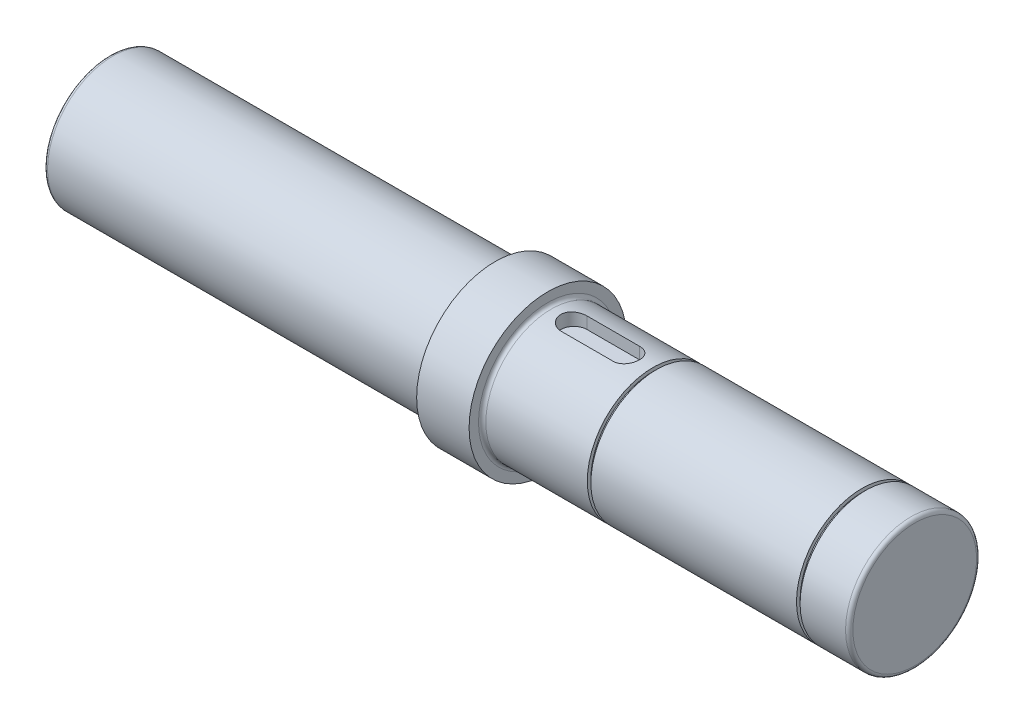
ISO-10303-21;
HEADER;
FILE_DESCRIPTION(('STEP AP214'),'2;1');
FILE_NAME('part.step','',(''),(''),'','','');
FILE_SCHEMA(('AUTOMOTIVE_DESIGN { 1 0 10303 214 1 1 1 1 }'));
ENDSEC;
DATA;
#1=APPLICATION_CONTEXT('core data for automotive mechanical design processes');
#2=APPLICATION_PROTOCOL_DEFINITION('international standard','automotive_design',2000,#1);
#3=PRODUCT_CONTEXT('',#1,'mechanical');
#4=PRODUCT('Part','Part','',(#3));
#5=PRODUCT_RELATED_PRODUCT_CATEGORY('part','',(#4));
#6=PRODUCT_DEFINITION_FORMATION('','',#4);
#7=PRODUCT_DEFINITION_CONTEXT('part definition',#1,'design');
#8=PRODUCT_DEFINITION('design','',#6,#7);
#9=PRODUCT_DEFINITION_SHAPE('','',#8);
#10=(LENGTH_UNIT() NAMED_UNIT(*) SI_UNIT(.MILLI.,.METRE.));
#11=(NAMED_UNIT(*) PLANE_ANGLE_UNIT() SI_UNIT($,.RADIAN.));
#12=(NAMED_UNIT(*) SI_UNIT($,.STERADIAN.) SOLID_ANGLE_UNIT());
#13=UNCERTAINTY_MEASURE_WITH_UNIT(LENGTH_MEASURE(1.E-05),#10,'distance_accuracy_value','');
#14=(GEOMETRIC_REPRESENTATION_CONTEXT(3) GLOBAL_UNCERTAINTY_ASSIGNED_CONTEXT((#13)) GLOBAL_UNIT_ASSIGNED_CONTEXT((#10,
#11,#12)) REPRESENTATION_CONTEXT('',''));
#15=CARTESIAN_POINT('',(0.,0.,0.));
#16=DIRECTION('',(0.,0.,1.));
#17=DIRECTION('',(1.,0.,0.));
#18=AXIS2_PLACEMENT_3D('',#15,#16,#17);
#19=CARTESIAN_POINT('',(0.,0.,0.));
#20=DIRECTION('',(-1.,0.,0.));
#21=DIRECTION('',(0.,0.,1.));
#22=AXIS2_PLACEMENT_3D('',#19,#20,#21);
#23=CYLINDRICAL_SURFACE('',#22,31.75);
#24=CARTESIAN_POINT('',(76.327,0.,0.));
#25=DIRECTION('',(-1.,0.,0.));
#26=DIRECTION('',(0.,0.,1.));
#27=AXIS2_PLACEMENT_3D('',#24,#25,#26);
#28=CIRCLE('',#27,31.75);
#29=CARTESIAN_POINT('',(76.327,0.,31.75));
#30=VERTEX_POINT('',#29);
#31=EDGE_CURVE('E101',#30,#30,#28,.T.);
#32=ORIENTED_EDGE('',*,*,#31,.T.);
#33=EDGE_LOOP('',(#32));
#34=FACE_BOUND('',#33,.T.);
#35=CARTESIAN_POINT('',(27.178,0.,0.));
#36=DIRECTION('',(-1.,0.,0.));
#37=DIRECTION('',(0.,0.,1.));
#38=AXIS2_PLACEMENT_3D('',#35,#36,#37);
#39=CIRCLE('',#38,31.75);
#40=CARTESIAN_POINT('',(27.178,0.,31.75));
#41=VERTEX_POINT('',#40);
#42=EDGE_CURVE('E197',#41,#41,#39,.T.);
#43=ORIENTED_EDGE('',*,*,#42,.F.);
#44=EDGE_LOOP('',(#43));
#45=FACE_BOUND('',#44,.T.);
#46=DIRECTION('',(-1.,0.,0.));
#47=VECTOR('',#46,1.);
#48=CARTESIAN_POINT('',(0.,31.1085197333464,6.35000000000001));
#49=LINE('',#48,#47);
#50=CARTESIAN_POINT('',(63.5,31.1085197333464,6.35));
#51=VERTEX_POINT('',#50);
#52=CARTESIAN_POINT('',(38.1,31.1085197333464,6.35));
#53=VERTEX_POINT('',#52);
#54=EDGE_CURVE('E62',#51,#53,#49,.T.);
#55=ORIENTED_EDGE('',*,*,#54,.T.);
#56=CARTESIAN_POINT('',(38.1,31.1085197333464,6.35));
#57=CARTESIAN_POINT('',(37.9233108351654,31.1085039048977,6.35002116870633));
#58=CARTESIAN_POINT('',(37.7466271481688,31.1100245268044,6.34262634497568));
#59=CARTESIAN_POINT('',(37.3945596487205,31.1160237603224,6.31315947098005));
#60=CARTESIAN_POINT('',(37.2191756781805,31.1205020060137,6.29108923636835));
#61=CARTESIAN_POINT('',(36.8712168207957,31.1322926618764,6.23247080872007));
#62=CARTESIAN_POINT('',(36.6986380696195,31.1396007541075,6.19594467145338));
#63=CARTESIAN_POINT('',(36.3572381754123,31.1568318420012,6.10870834329766));
#64=CARTESIAN_POINT('',(36.1884170477239,31.1667548483385,6.05799809450528));
#65=CARTESIAN_POINT('',(35.8557252699625,31.1889277561932,5.9427871683123));
#66=CARTESIAN_POINT('',(35.6918541559509,31.2011774388544,5.87828778789978));
#67=CARTESIAN_POINT('',(35.3701060160581,31.2276576717888,5.73595117685301));
#68=CARTESIAN_POINT('',(35.2122312346987,31.2418889546844,5.65810901075327));
#69=CARTESIAN_POINT('',(34.9036441102659,31.2719221019036,5.48969019735091));
#70=CARTESIAN_POINT('',(34.7529297440003,31.287723518634,5.39911717615937));
#71=CARTESIAN_POINT('',(34.4595578971861,31.3204654741843,5.20581898773431));
#72=CARTESIAN_POINT('',(34.3169034553038,31.3374064374204,5.10308928189229));
#73=CARTESIAN_POINT('',(34.0389617000876,31.3721657870236,4.88488113848266));
#74=CARTESIAN_POINT('',(33.9037854871061,31.3899923559764,4.76926246734966));
#75=CARTESIAN_POINT('',(33.64356928295,31.4258358202982,4.52706640642534));
#76=CARTESIAN_POINT('',(33.5185330670073,31.443852783757,4.40048497101893));
#77=CARTESIAN_POINT('',(33.2795240400947,31.4795651952709,4.13728229219212));
#78=CARTESIAN_POINT('',(33.1655489025911,31.4972607102985,4.00066317071855));
#79=CARTESIAN_POINT('',(32.9493767320231,31.5318494290015,3.71822762063949));
#80=CARTESIAN_POINT('',(32.8471840554499,31.5487423345683,3.57240782077796));
#81=CARTESIAN_POINT('',(32.6545430961016,31.5813855066594,3.27134555408801));
#82=CARTESIAN_POINT('',(32.5642000814885,31.5971250461394,3.11603453473924));
#83=CARTESIAN_POINT('',(32.396906241239,31.6268635269183,2.79812380902994));
#84=CARTESIAN_POINT('',(32.3199604381656,31.6408618148695,2.63552139776));
#85=CARTESIAN_POINT('',(32.1801224672853,31.6667053478679,2.30431058211544));
#86=CARTESIAN_POINT('',(32.1172233211822,31.6785516614553,2.13570520846399));
#87=CARTESIAN_POINT('',(32.0059026664174,31.699763919737,1.79355860197955));
#88=CARTESIAN_POINT('',(31.9574863984016,31.7091289664424,1.62001560727813));
#89=CARTESIAN_POINT('',(31.876099930763,31.7249958152219,1.271665337988));
#90=CARTESIAN_POINT('',(31.8429321188382,31.7315341792257,1.09690588587055));
#91=CARTESIAN_POINT('',(31.7913652175721,31.7417427444523,0.745135527954367));
#92=CARTESIAN_POINT('',(31.7729662367973,31.7454129245909,0.568124605614686));
#93=CARTESIAN_POINT('',(31.7510881876713,31.7497805646417,0.213158804110465));
#94=CARTESIAN_POINT('',(31.7476080858247,31.7504782304726,0.0352039911884503));
#95=CARTESIAN_POINT('',(31.7555935614074,31.7488815175662,-0.320355861532066));
#96=CARTESIAN_POINT('',(31.767059035046,31.7465871596071,-0.497960903751));
#97=CARTESIAN_POINT('',(31.8045715380183,31.7391255185198,-0.848995672171194));
#98=CARTESIAN_POINT('',(31.8304081642491,31.7339996971821,-1.02244881452811));
#99=CARTESIAN_POINT('',(31.8963081823647,31.7210458476606,-1.36652479398735));
#100=CARTESIAN_POINT('',(31.9363713334678,31.7132178652105,-1.53714767894016));
#101=CARTESIAN_POINT('',(32.0304249188964,31.6950723967427,-1.87441004012347));
#102=CARTESIAN_POINT('',(32.0844181319873,31.6847544140469,-2.04104871432941));
#103=CARTESIAN_POINT('',(32.2059001366246,31.6619149454476,-2.36910786568285));
#104=CARTESIAN_POINT('',(32.2733842512283,31.6493942233562,-2.53053012875757));
#105=CARTESIAN_POINT('',(32.4218601783,31.6223957034097,-2.84818724824965));
#106=CARTESIAN_POINT('',(32.502939035027,31.6079054159621,-3.00438035215416));
#107=CARTESIAN_POINT('',(32.6776712522136,31.5774326747622,-3.30933886567148));
#108=CARTESIAN_POINT('',(32.7713202179686,31.561450743104,-3.45810684639707));
#109=CARTESIAN_POINT('',(32.970603500097,31.5284165857884,-3.74735222897073));
#110=CARTESIAN_POINT('',(33.0762428402126,31.5113639128573,-3.88782611799903));
#111=CARTESIAN_POINT('',(33.298716928451,31.4766620567231,-4.15944574616747));
#112=CARTESIAN_POINT('',(33.4155477604606,31.4590130835657,-4.2905947204857));
#113=CARTESIAN_POINT('',(33.6618218514731,31.4232767982799,-4.54499379526856));
#114=CARTESIAN_POINT('',(33.7914517850338,31.4051872576023,-4.6680629439482));
#115=CARTESIAN_POINT('',(34.0606029663649,31.3693950976011,-4.90282051214633));
#116=CARTESIAN_POINT('',(34.2001206430503,31.3516923415769,-5.01451300532672));
#117=CARTESIAN_POINT('',(34.488239139017,31.3171574864215,-5.22586107228326));
#118=CARTESIAN_POINT('',(34.6368458747266,31.3003259678598,-5.32550867723439));
#119=CARTESIAN_POINT('',(34.9419884353452,31.2680353267224,-5.5119340520932));
#120=CARTESIAN_POINT('',(35.098521209755,31.252575682364,-5.59871672358086));
#121=CARTESIAN_POINT('',(35.4189874205828,31.223425373653,-5.75906880614595));
#122=CARTESIAN_POINT('',(35.5829423302281,31.2097403519898,-5.83259634629917));
#123=CARTESIAN_POINT('',(35.9165786830982,31.1846063686895,-5.96551779545906));
#124=CARTESIAN_POINT('',(36.0862578593376,31.1731565337636,-6.02491722631501));
#125=CARTESIAN_POINT('',(36.4300011137611,31.1528408342497,-6.12909659949344));
#126=CARTESIAN_POINT('',(36.6040604163827,31.1439722775706,-6.1738917789216));
#127=CARTESIAN_POINT('',(36.9553966617676,31.1290753988845,-6.24856905180784));
#128=CARTESIAN_POINT('',(37.1326720326826,31.1230457262539,-6.27845823732312));
#129=CARTESIAN_POINT('',(37.4418341863337,31.1152061209695,-6.31717753778337));
#130=CARTESIAN_POINT('',(37.573278000551,31.1127009336914,-6.32949166864359));
#131=CARTESIAN_POINT('',(37.8364771978161,31.1093569479481,-6.34589839064755));
#132=CARTESIAN_POINT('',(37.9682316881389,31.1085153607586,-6.35000474077799));
#133=CARTESIAN_POINT('',(38.1,31.1085197333464,-6.35));
#134=B_SPLINE_CURVE_WITH_KNOTS('',3,(#56,#57,#58,#59,#60,#61,#62,#63,#64,#65,#66,#67,#68,#69,
#70,#71,#72,#73,#74,#75,#76,#77,#78,#79,#80,#81,#82,#83,#84,#85,#86,#87,#88,#89,#90,#91,#92,#93,
#94,#95,#96,#97,#98,#99,#100,#101,#102,#103,#104,#105,#106,#107,#108,#109,#110,#111,#112,#113,
#114,#115,#116,#117,#118,#119,#120,#121,#122,#123,#124,#125,#126,#127,#128,#129,#130,#131,#132,
#133),.UNSPECIFIED.,.F.,.F.,(4,2,2,2,2,2,2,2,2,2,2,2,2,2,2,2,2,2,2,2,2,2,2,2,2,2,2,2,2,2,2,2,2,
2,2,2,2,2,4),(0.,0.529898040772802,1.05973053434175,1.58875774510194,2.11778711552501,
2.64676674799753,3.17594247273483,3.70496777739679,4.23419121660084,4.76987063032171,
5.30574857636785,5.84151356303558,6.37747601445001,6.91791683404275,7.45855982859046,
7.9989336344186,8.53950273925023,9.07285386554479,9.6062089124942,10.1395270110335,
10.6728414059212,11.1985457780125,11.7242412530668,12.2500416749135,12.775660130621,
13.3047823855987,13.8337201307617,14.362880314746,14.8918560073651,15.4301968495918,
15.9683442443244,16.5068457476941,17.0451415500575,17.5851090378882,18.1248651360272,
18.6640562728021,19.2029906248677,19.5988660670097,19.9940773310255),.UNSPECIFIED.);
#135=CARTESIAN_POINT('',(38.1,31.1085197333464,-6.35));
#136=VERTEX_POINT('',#135);
#137=EDGE_CURVE('E11',#53,#136,#134,.T.);
#138=ORIENTED_EDGE('',*,*,#137,.T.);
#139=DIRECTION('',(-1.,0.,0.));
#140=VECTOR('',#139,1.);
#141=CARTESIAN_POINT('',(0.,31.1085197333464,-6.34999999999999));
#142=LINE('',#141,#140);
#143=CARTESIAN_POINT('',(63.5,31.1085197333464,-6.34999999999999));
#144=VERTEX_POINT('',#143);
#145=EDGE_CURVE('E201',#144,#136,#142,.T.);
#146=ORIENTED_EDGE('',*,*,#145,.F.);
#147=CARTESIAN_POINT('',(63.5,31.1085197333464,-6.35));
#148=CARTESIAN_POINT('',(63.6766891648346,31.1085039048977,-6.35002116870633));
#149=CARTESIAN_POINT('',(63.8533728518311,31.1100245268044,-6.34262634497569));
#150=CARTESIAN_POINT('',(64.2054403512795,31.1160237603224,-6.31315947098006));
#151=CARTESIAN_POINT('',(64.3808243218194,31.1205020060137,-6.29108923636836));
#152=CARTESIAN_POINT('',(64.7287831792042,31.1322926618764,-6.23247080872008));
#153=CARTESIAN_POINT('',(64.9013619303804,31.1396007541075,-6.19594467145338));
#154=CARTESIAN_POINT('',(65.2427618245877,31.1568318420012,-6.10870834329767));
#155=CARTESIAN_POINT('',(65.4115829522761,31.1667548483385,-6.05799809450529));
#156=CARTESIAN_POINT('',(65.7442747300375,31.1889277561932,-5.94278716831231));
#157=CARTESIAN_POINT('',(65.9081458440491,31.2011774388544,-5.87828778789979));
#158=CARTESIAN_POINT('',(66.2298939839419,31.2276576717888,-5.73595117685302));
#159=CARTESIAN_POINT('',(66.3877687653012,31.2418889546844,-5.65810901075328));
#160=CARTESIAN_POINT('',(66.6963558897341,31.2719221019036,-5.48969019735092));
#161=CARTESIAN_POINT('',(66.8470702559996,31.287723518634,-5.39911717615938));
#162=CARTESIAN_POINT('',(67.1404421028139,31.3204654741843,-5.20581898773432));
#163=CARTESIAN_POINT('',(67.2830965446962,31.3374064374204,-5.1030892818923));
#164=CARTESIAN_POINT('',(67.5610382999123,31.3721657870236,-4.88488113848267));
#165=CARTESIAN_POINT('',(67.6962145128939,31.3899923559764,-4.76926246734967));
#166=CARTESIAN_POINT('',(67.9564307170499,31.4258358202982,-4.52706640642534));
#167=CARTESIAN_POINT('',(68.0814669329927,31.443852783757,-4.40048497101893));
#168=CARTESIAN_POINT('',(68.3204759599053,31.4795651952708,-4.13728229219212));
#169=CARTESIAN_POINT('',(68.4344510974089,31.4972607102985,-4.00066317071856));
#170=CARTESIAN_POINT('',(68.6506232679768,31.5318494290015,-3.7182276206395));
#171=CARTESIAN_POINT('',(68.7528159445501,31.5487423345683,-3.57240782077797));
#172=CARTESIAN_POINT('',(68.9454569038983,31.5813855066594,-3.27134555408803));
#173=CARTESIAN_POINT('',(69.0357999185114,31.5971250461394,-3.11603453473926));
#174=CARTESIAN_POINT('',(69.2030937587609,31.6268635269183,-2.79812380902996));
#175=CARTESIAN_POINT('',(69.2800395618344,31.6408618148695,-2.63552139776002));
#176=CARTESIAN_POINT('',(69.4198775327146,31.6667053478679,-2.30431058211546));
#177=CARTESIAN_POINT('',(69.4827766788177,31.6785516614553,-2.13570520846401));
#178=CARTESIAN_POINT('',(69.5940973335826,31.699763919737,-1.79355860197957));
#179=CARTESIAN_POINT('',(69.6425136015984,31.7091289664424,-1.62001560727815));
#180=CARTESIAN_POINT('',(69.723900069237,31.7249958152219,-1.27166533798801));
#181=CARTESIAN_POINT('',(69.7570678811618,31.7315341792257,-1.09690588587056));
#182=CARTESIAN_POINT('',(69.8086347824278,31.7417427444523,-0.745135527954382));
#183=CARTESIAN_POINT('',(69.8270337632026,31.7454129245909,-0.568124605614701));
#184=CARTESIAN_POINT('',(69.8489118123287,31.7497805646417,-0.213158804110481));
#185=CARTESIAN_POINT('',(69.8523919141753,31.7504782304726,-0.0352039911884656));
#186=CARTESIAN_POINT('',(69.8444064385925,31.7488815175662,0.320355861532051));
#187=CARTESIAN_POINT('',(69.832940964954,31.7465871596071,0.497960903750986));
#188=CARTESIAN_POINT('',(69.7954284619817,31.7391255185198,0.848995672171182));
#189=CARTESIAN_POINT('',(69.7695918357508,31.7339996971821,1.0224488145281));
#190=CARTESIAN_POINT('',(69.7036918176353,31.7210458476606,1.36652479398733));
#191=CARTESIAN_POINT('',(69.6636286665322,31.7132178652105,1.53714767894015));
#192=CARTESIAN_POINT('',(69.5695750811035,31.6950723967427,1.87441004012346));
#193=CARTESIAN_POINT('',(69.5155818680127,31.6847544140469,2.04104871432941));
#194=CARTESIAN_POINT('',(69.3940998633754,31.6619149454476,2.36910786568284));
#195=CARTESIAN_POINT('',(69.3266157487717,31.6493942233562,2.53053012875756));
#196=CARTESIAN_POINT('',(69.1781398216999,31.6223957034097,2.84818724824964));
#197=CARTESIAN_POINT('',(69.097060964973,31.6079054159621,3.00438035215415));
#198=CARTESIAN_POINT('',(68.9223287477864,31.5774326747622,3.30933886567147));
#199=CARTESIAN_POINT('',(68.8286797820313,31.561450743104,3.45810684639706));
#200=CARTESIAN_POINT('',(68.629396499903,31.5284165857884,3.74735222897071));
#201=CARTESIAN_POINT('',(68.5237571597874,31.5113639128573,3.88782611799901));
#202=CARTESIAN_POINT('',(68.301283071549,31.4766620567231,4.15944574616745));
#203=CARTESIAN_POINT('',(68.1844522395394,31.4590130835657,4.29059472048568));
#204=CARTESIAN_POINT('',(67.9381781485269,31.4232767982799,4.54499379526855));
#205=CARTESIAN_POINT('',(67.8085482149662,31.4051872576023,4.66806294394819));
#206=CARTESIAN_POINT('',(67.539397033635,31.3693950976011,4.90282051214631));
#207=CARTESIAN_POINT('',(67.3998793569497,31.3516923415769,5.0145130053267));
#208=CARTESIAN_POINT('',(67.111760860983,31.3171574864215,5.22586107228324));
#209=CARTESIAN_POINT('',(66.9631541252734,31.3003259678598,5.32550867723437));
#210=CARTESIAN_POINT('',(66.6580115646548,31.2680353267224,5.51193405209319));
#211=CARTESIAN_POINT('',(66.501478790245,31.252575682364,5.59871672358085));
#212=CARTESIAN_POINT('',(66.1810125794172,31.223425373653,5.75906880614594));
#213=CARTESIAN_POINT('',(66.0170576697719,31.2097403519898,5.83259634629916));
#214=CARTESIAN_POINT('',(65.6834213169018,31.1846063686895,5.96551779545906));
#215=CARTESIAN_POINT('',(65.5137421406623,31.1731565337636,6.024917226315));
#216=CARTESIAN_POINT('',(65.1699988862389,31.1528408342497,6.12909659949343));
#217=CARTESIAN_POINT('',(64.9959395836173,31.1439722775706,6.1738917789216));
#218=CARTESIAN_POINT('',(64.6446033382323,31.1290753988845,6.24856905180784));
#219=CARTESIAN_POINT('',(64.4673279673174,31.1230457262539,6.27845823732312));
#220=CARTESIAN_POINT('',(64.1581658136663,31.1152061209695,6.31717753778337));
#221=CARTESIAN_POINT('',(64.0267219994489,31.1127009336914,6.32949166864359));
#222=CARTESIAN_POINT('',(63.7635228021838,31.1093569479481,6.34589839064755));
#223=CARTESIAN_POINT('',(63.6317683118611,31.1085153607586,6.35000474077798));
#224=CARTESIAN_POINT('',(63.5,31.1085197333464,6.35));
#225=B_SPLINE_CURVE_WITH_KNOTS('',3,(#147,#148,#149,#150,#151,#152,#153,#154,#155,#156,#157,
#158,#159,#160,#161,#162,#163,#164,#165,#166,#167,#168,#169,#170,#171,#172,#173,#174,#175,#176,
#177,#178,#179,#180,#181,#182,#183,#184,#185,#186,#187,#188,#189,#190,#191,#192,#193,#194,#195,
#196,#197,#198,#199,#200,#201,#202,#203,#204,#205,#206,#207,#208,#209,#210,#211,#212,#213,#214,
#215,#216,#217,#218,#219,#220,#221,#222,#223,#224),.UNSPECIFIED.,.F.,.F.,(4,2,2,2,2,2,2,2,2,2,2,
2,2,2,2,2,2,2,2,2,2,2,2,2,2,2,2,2,2,2,2,2,2,2,2,2,2,2,4),(0.,0.529898040772788,1.05973053434174,
1.58875774510192,2.117787115525,2.64676674799751,3.17594247273482,3.70496777739679,
4.23419121660083,4.7698706303217,5.30574857636785,5.84151356303558,6.37747601445,
6.91791683404273,7.45855982859044,7.99893363441858,8.53950273925021,9.07285386554477,
9.60620891249419,10.1395270110335,10.6728414059212,11.1985457780125,11.7242412530668,
12.2500416749135,12.775660130621,13.3047823855987,13.8337201307617,14.362880314746,
14.8918560073651,15.4301968495918,15.9683442443244,16.5068457476941,17.0451415500575,
17.5851090378882,18.1248651360272,18.6640562728021,19.2029906248677,19.5988660670097,
19.9940773310255),.UNSPECIFIED.);
#226=EDGE_CURVE('E204',#144,#51,#225,.T.);
#227=ORIENTED_EDGE('',*,*,#226,.T.);
#228=EDGE_LOOP('',(#55,#138,#146,#227));
#229=FACE_BOUND('',#228,.T.);
#230=ADVANCED_FACE('F47',(#34,#45,#229),#23,.T.);
#231=CARTESIAN_POINT('',(27.178,0.,0.));
#232=DIRECTION('',(-1.,0.,0.));
#233=DIRECTION('',(0.,0.,1.));
#234=AXIS2_PLACEMENT_3D('',#231,#232,#233);
#235=TOROIDAL_SURFACE('',#234,33.528,1.778);
#236=CARTESIAN_POINT('',(25.4,0.,0.));
#237=DIRECTION('',(-1.,0.,0.));
#238=DIRECTION('',(0.,0.,1.));
#239=AXIS2_PLACEMENT_3D('',#236,#237,#238);
#240=CIRCLE('',#239,33.528);
#241=CARTESIAN_POINT('',(25.4,0.,33.528));
#242=VERTEX_POINT('',#241);
#243=EDGE_CURVE('E193',#242,#242,#240,.T.);
#244=ORIENTED_EDGE('',*,*,#243,.F.);
#245=EDGE_LOOP('',(#244));
#246=FACE_BOUND('',#245,.T.);
#247=ORIENTED_EDGE('',*,*,#42,.T.);
#248=EDGE_LOOP('',(#247));
#249=FACE_BOUND('',#248,.T.);
#250=ADVANCED_FACE('F49',(#246,#249),#235,.F.);
#251=CARTESIAN_POINT('',(25.4,0.,0.));
#252=DIRECTION('',(-1.,0.,0.));
#253=DIRECTION('',(0.,0.,1.));
#254=AXIS2_PLACEMENT_3D('',#251,#252,#253);
#255=PLANE('',#254);
#256=CARTESIAN_POINT('',(25.4,0.,0.));
#257=DIRECTION('',(-1.,0.,0.));
#258=DIRECTION('',(0.,0.,1.));
#259=AXIS2_PLACEMENT_3D('',#256,#257,#258);
#260=CIRCLE('',#259,38.1);
#261=CARTESIAN_POINT('',(25.4,0.,38.1));
#262=VERTEX_POINT('',#261);
#263=EDGE_CURVE('E189',#262,#262,#260,.T.);
#264=ORIENTED_EDGE('',*,*,#263,.F.);
#265=EDGE_LOOP('',(#264));
#266=FACE_BOUND('',#265,.T.);
#267=ORIENTED_EDGE('',*,*,#243,.T.);
#268=EDGE_LOOP('',(#267));
#269=FACE_BOUND('',#268,.T.);
#270=ADVANCED_FACE('F251',(#266,#269),#255,.F.);
#271=CARTESIAN_POINT('',(0.,0.,0.));
#272=DIRECTION('',(-1.,0.,0.));
#273=DIRECTION('',(0.,0.,1.));
#274=AXIS2_PLACEMENT_3D('',#271,#272,#273);
#275=CYLINDRICAL_SURFACE('',#274,38.1);
#276=CARTESIAN_POINT('',(0.,0.,0.));
#277=DIRECTION('',(-1.,0.,0.));
#278=DIRECTION('',(0.,0.,1.));
#279=AXIS2_PLACEMENT_3D('',#276,#277,#278);
#280=CIRCLE('',#279,38.1);
#281=CARTESIAN_POINT('',(0.,0.,38.1));
#282=VERTEX_POINT('',#281);
#283=EDGE_CURVE('E185',#282,#282,#280,.T.);
#284=ORIENTED_EDGE('',*,*,#283,.F.);
#285=EDGE_LOOP('',(#284));
#286=FACE_BOUND('',#285,.T.);
#287=ORIENTED_EDGE('',*,*,#263,.T.);
#288=EDGE_LOOP('',(#287));
#289=FACE_BOUND('',#288,.T.);
#290=ADVANCED_FACE('F299',(#286,#289),#275,.T.);
#291=CARTESIAN_POINT('',(0.,0.,0.));
#292=DIRECTION('',(-1.,0.,0.));
#293=DIRECTION('',(0.,0.,1.));
#294=AXIS2_PLACEMENT_3D('',#291,#292,#293);
#295=PLANE('',#294);
#296=ORIENTED_EDGE('',*,*,#283,.T.);
#297=EDGE_LOOP('',(#296));
#298=FACE_BOUND('',#297,.T.);
#299=CARTESIAN_POINT('',(0.,0.,0.));
#300=DIRECTION('',(-1.,0.,0.));
#301=DIRECTION('',(0.,0.,1.));
#302=AXIS2_PLACEMENT_3D('',#299,#300,#301);
#303=CIRCLE('',#302,33.528);
#304=CARTESIAN_POINT('',(0.,0.,33.528));
#305=VERTEX_POINT('',#304);
#306=EDGE_CURVE('E181',#305,#305,#303,.T.);
#307=ORIENTED_EDGE('',*,*,#306,.F.);
#308=EDGE_LOOP('',(#307));
#309=FACE_BOUND('',#308,.T.);
#310=ADVANCED_FACE('F295',(#298,#309),#295,.T.);
#311=CARTESIAN_POINT('',(-1.778,0.,0.));
#312=DIRECTION('',(-1.,0.,0.));
#313=DIRECTION('',(0.,0.,1.));
#314=AXIS2_PLACEMENT_3D('',#311,#312,#313);
#315=TOROIDAL_SURFACE('',#314,33.528,1.778);
#316=ORIENTED_EDGE('',*,*,#306,.T.);
#317=EDGE_LOOP('',(#316));
#318=FACE_BOUND('',#317,.T.);
#319=CARTESIAN_POINT('',(-1.77800000000001,0.,0.));
#320=DIRECTION('',(-1.,0.,0.));
#321=DIRECTION('',(0.,0.,1.));
#322=AXIS2_PLACEMENT_3D('',#319,#320,#321);
#323=CIRCLE('',#322,31.75);
#324=CARTESIAN_POINT('',(-1.77800000000001,0.,31.75));
#325=VERTEX_POINT('',#324);
#326=EDGE_CURVE('E177',#325,#325,#323,.T.);
#327=ORIENTED_EDGE('',*,*,#326,.F.);
#328=EDGE_LOOP('',(#327));
#329=FACE_BOUND('',#328,.T.);
#330=ADVANCED_FACE('F291',(#318,#329),#315,.F.);
#331=CARTESIAN_POINT('',(0.,0.,0.));
#332=DIRECTION('',(-1.,0.,0.));
#333=DIRECTION('',(0.,0.,1.));
#334=AXIS2_PLACEMENT_3D('',#331,#332,#333);
#335=CYLINDRICAL_SURFACE('',#334,31.75);
#336=CARTESIAN_POINT('',(-185.166,0.,0.));
#337=DIRECTION('',(-1.,0.,0.));
#338=DIRECTION('',(0.,0.,1.));
#339=AXIS2_PLACEMENT_3D('',#336,#337,#338);
#340=CIRCLE('',#339,31.75);
#341=CARTESIAN_POINT('',(-185.166,0.,31.75));
#342=VERTEX_POINT('',#341);
#343=EDGE_CURVE('E173',#342,#342,#340,.T.);
#344=ORIENTED_EDGE('',*,*,#343,.F.);
#345=EDGE_LOOP('',(#344));
#346=FACE_BOUND('',#345,.T.);
#347=ORIENTED_EDGE('',*,*,#326,.T.);
#348=EDGE_LOOP('',(#347));
#349=FACE_BOUND('',#348,.T.);
#350=ADVANCED_FACE('F287',(#346,#349),#335,.T.);
#351=CARTESIAN_POINT('',(-185.166,0.,0.));
#352=DIRECTION('',(-1.,0.,0.));
#353=DIRECTION('',(0.,0.,1.));
#354=AXIS2_PLACEMENT_3D('',#351,#352,#353);
#355=TOROIDAL_SURFACE('',#354,29.972,1.778);
#356=ORIENTED_EDGE('',*,*,#343,.T.);
#357=EDGE_LOOP('',(#356));
#358=FACE_BOUND('',#357,.T.);
#359=CARTESIAN_POINT('',(-186.944,0.,0.));
#360=DIRECTION('',(-1.,0.,0.));
#361=DIRECTION('',(0.,0.,1.));
#362=AXIS2_PLACEMENT_3D('',#359,#360,#361);
#363=CIRCLE('',#362,29.972);
#364=CARTESIAN_POINT('',(-186.944,0.,29.972));
#365=VERTEX_POINT('',#364);
#366=EDGE_CURVE('E169',#365,#365,#363,.T.);
#367=ORIENTED_EDGE('',*,*,#366,.F.);
#368=EDGE_LOOP('',(#367));
#369=FACE_BOUND('',#368,.T.);
#370=ADVANCED_FACE('F281',(#358,#369),#355,.T.);
#371=CARTESIAN_POINT('',(-186.944,0.,0.));
#372=DIRECTION('',(-1.,0.,0.));
#373=DIRECTION('',(0.,0.,1.));
#374=AXIS2_PLACEMENT_3D('',#371,#372,#373);
#375=PLANE('',#374);
#376=ORIENTED_EDGE('',*,*,#366,.T.);
#377=EDGE_LOOP('',(#376));
#378=FACE_BOUND('',#377,.T.);
#379=ADVANCED_FACE('F276',(#378),#375,.T.);
#380=CARTESIAN_POINT('',(203.2,0.,1.88173394004264E-13));
#381=DIRECTION('',(-1.,0.,0.));
#382=DIRECTION('',(0.,0.,1.));
#383=AXIS2_PLACEMENT_3D('',#380,#381,#382);
#384=PLANE('',#383);
#385=CARTESIAN_POINT('',(203.2,0.,0.));
#386=DIRECTION('',(-1.,0.,0.));
#387=DIRECTION('',(0.,0.,1.));
#388=AXIS2_PLACEMENT_3D('',#385,#386,#387);
#389=CIRCLE('',#388,29.972);
#390=CARTESIAN_POINT('',(203.2,0.,29.972));
#391=VERTEX_POINT('',#390);
#392=EDGE_CURVE('E165',#391,#391,#389,.T.);
#393=ORIENTED_EDGE('',*,*,#392,.F.);
#394=EDGE_LOOP('',(#393));
#395=FACE_BOUND('',#394,.T.);
#396=ADVANCED_FACE('F265',(#395),#384,.F.);
#397=CARTESIAN_POINT('',(201.422,0.,0.));
#398=DIRECTION('',(-1.,0.,0.));
#399=DIRECTION('',(0.,0.,1.));
#400=AXIS2_PLACEMENT_3D('',#397,#398,#399);
#401=TOROIDAL_SURFACE('',#400,29.972,1.77800000000001);
#402=CARTESIAN_POINT('',(201.422,0.,0.));
#403=DIRECTION('',(-1.,0.,0.));
#404=DIRECTION('',(0.,0.,1.));
#405=AXIS2_PLACEMENT_3D('',#402,#403,#404);
#406=CIRCLE('',#405,31.75);
#407=CARTESIAN_POINT('',(201.422,0.,31.75));
#408=VERTEX_POINT('',#407);
#409=EDGE_CURVE('E161',#408,#408,#406,.T.);
#410=ORIENTED_EDGE('',*,*,#409,.F.);
#411=EDGE_LOOP('',(#410));
#412=FACE_BOUND('',#411,.T.);
#413=ORIENTED_EDGE('',*,*,#392,.T.);
#414=EDGE_LOOP('',(#413));
#415=FACE_BOUND('',#414,.T.);
#416=ADVANCED_FACE('F256',(#412,#415),#401,.T.);
#417=ORIENTED_EDGE('',*,*,#409,.T.);
#418=EDGE_LOOP('',(#417));
#419=FACE_BOUND('',#418,.T.);
#420=CARTESIAN_POINT('',(179.4002,0.,0.));
#421=DIRECTION('',(-1.,0.,0.));
#422=DIRECTION('',(0.,0.,1.));
#423=AXIS2_PLACEMENT_3D('',#420,#421,#422);
#424=CIRCLE('',#423,31.75);
#425=CARTESIAN_POINT('',(179.4002,0.,31.75));
#426=VERTEX_POINT('',#425);
#427=EDGE_CURVE('E157',#426,#426,#424,.T.);
#428=ORIENTED_EDGE('',*,*,#427,.F.);
#429=EDGE_LOOP('',(#428));
#430=FACE_BOUND('',#429,.T.);
#431=ADVANCED_FACE('F243',(#419,#430),#23,.T.);
#432=CARTESIAN_POINT('',(179.4002,0.,0.));
#433=DIRECTION('',(1.,0.,0.));
#434=DIRECTION('',(0.,0.,-1.));
#435=AXIS2_PLACEMENT_3D('',#432,#433,#434);
#436=PLANE('',#435);
#437=CARTESIAN_POINT('',(179.4002,0.,0.));
#438=DIRECTION('',(-1.,0.,0.));
#439=DIRECTION('',(0.,0.,1.));
#440=AXIS2_PLACEMENT_3D('',#437,#438,#439);
#441=CIRCLE('',#440,30.0228);
#442=CARTESIAN_POINT('',(179.4002,0.,30.0228));
#443=VERTEX_POINT('',#442);
#444=EDGE_CURVE('E153',#443,#443,#441,.T.);
#445=ORIENTED_EDGE('',*,*,#444,.F.);
#446=EDGE_LOOP('',(#445));
#447=FACE_BOUND('',#446,.T.);
#448=ORIENTED_EDGE('',*,*,#427,.T.);
#449=EDGE_LOOP('',(#448));
#450=FACE_BOUND('',#449,.T.);
#451=ADVANCED_FACE('F255',(#447,#450),#436,.F.);
#452=CARTESIAN_POINT('',(0.,0.,0.));
#453=DIRECTION('',(-1.,0.,0.));
#454=DIRECTION('',(0.,0.,1.));
#455=AXIS2_PLACEMENT_3D('',#452,#453,#454);
#456=CYLINDRICAL_SURFACE('',#455,30.0228);
#457=ORIENTED_EDGE('',*,*,#444,.T.);
#458=EDGE_LOOP('',(#457));
#459=FACE_BOUND('',#458,.T.);
#460=CARTESIAN_POINT('',(177.673,0.,0.));
#461=DIRECTION('',(-1.,0.,0.));
#462=DIRECTION('',(0.,0.,1.));
#463=AXIS2_PLACEMENT_3D('',#460,#461,#462);
#464=CIRCLE('',#463,30.0228);
#465=CARTESIAN_POINT('',(177.673,0.,30.0228));
#466=VERTEX_POINT('',#465);
#467=EDGE_CURVE('E149',#466,#466,#464,.T.);
#468=ORIENTED_EDGE('',*,*,#467,.F.);
#469=EDGE_LOOP('',(#468));
#470=FACE_BOUND('',#469,.T.);
#471=ADVANCED_FACE('F262',(#459,#470),#456,.T.);
#472=CARTESIAN_POINT('',(177.673,0.,0.));
#473=DIRECTION('',(1.,0.,0.));
#474=DIRECTION('',(0.,0.,-1.));
#475=AXIS2_PLACEMENT_3D('',#472,#473,#474);
#476=PLANE('',#475);
#477=ORIENTED_EDGE('',*,*,#467,.T.);
#478=EDGE_LOOP('',(#477));
#479=FACE_BOUND('',#478,.T.);
#480=CARTESIAN_POINT('',(177.673,0.,0.));
#481=DIRECTION('',(-1.,0.,0.));
#482=DIRECTION('',(0.,0.,1.));
#483=AXIS2_PLACEMENT_3D('',#480,#481,#482);
#484=CIRCLE('',#483,31.75);
#485=CARTESIAN_POINT('',(177.673,0.,31.75));
#486=VERTEX_POINT('',#485);
#487=EDGE_CURVE('E145',#486,#486,#484,.T.);
#488=ORIENTED_EDGE('',*,*,#487,.F.);
#489=EDGE_LOOP('',(#488));
#490=FACE_BOUND('',#489,.T.);
#491=ADVANCED_FACE('F241',(#479,#490),#476,.T.);
#492=ORIENTED_EDGE('',*,*,#487,.T.);
#493=EDGE_LOOP('',(#492));
#494=FACE_BOUND('',#493,.T.);
#495=CARTESIAN_POINT('',(78.0542,0.,0.));
#496=DIRECTION('',(-1.,0.,0.));
#497=DIRECTION('',(0.,0.,1.));
#498=AXIS2_PLACEMENT_3D('',#495,#496,#497);
#499=CIRCLE('',#498,31.75);
#500=CARTESIAN_POINT('',(78.0542,0.,31.75));
#501=VERTEX_POINT('',#500);
#502=EDGE_CURVE('E141',#501,#501,#499,.T.);
#503=ORIENTED_EDGE('',*,*,#502,.F.);
#504=EDGE_LOOP('',(#503));
#505=FACE_BOUND('',#504,.T.);
#506=ADVANCED_FACE('F212',(#494,#505),#23,.T.);
#507=CARTESIAN_POINT('',(78.0542,0.,0.));
#508=DIRECTION('',(1.,0.,0.));
#509=DIRECTION('',(0.,0.,-1.));
#510=AXIS2_PLACEMENT_3D('',#507,#508,#509);
#511=PLANE('',#510);
#512=CARTESIAN_POINT('',(78.0542,0.,0.));
#513=DIRECTION('',(-1.,0.,0.));
#514=DIRECTION('',(0.,0.,1.));
#515=AXIS2_PLACEMENT_3D('',#512,#513,#514);
#516=CIRCLE('',#515,30.0228);
#517=CARTESIAN_POINT('',(78.0542,0.,30.0228));
#518=VERTEX_POINT('',#517);
#519=EDGE_CURVE('E137',#518,#518,#516,.T.);
#520=ORIENTED_EDGE('',*,*,#519,.F.);
#521=EDGE_LOOP('',(#520));
#522=FACE_BOUND('',#521,.T.);
#523=ORIENTED_EDGE('',*,*,#502,.T.);
#524=EDGE_LOOP('',(#523));
#525=FACE_BOUND('',#524,.T.);
#526=ADVANCED_FACE('F234',(#522,#525),#511,.F.);
#527=CARTESIAN_POINT('',(0.,0.,0.));
#528=DIRECTION('',(-1.,0.,0.));
#529=DIRECTION('',(0.,0.,1.));
#530=AXIS2_PLACEMENT_3D('',#527,#528,#529);
#531=CYLINDRICAL_SURFACE('',#530,30.0228);
#532=ORIENTED_EDGE('',*,*,#519,.T.);
#533=EDGE_LOOP('',(#532));
#534=FACE_BOUND('',#533,.T.);
#535=CARTESIAN_POINT('',(76.327,0.,0.));
#536=DIRECTION('',(-1.,0.,0.));
#537=DIRECTION('',(0.,0.,1.));
#538=AXIS2_PLACEMENT_3D('',#535,#536,#537);
#539=CIRCLE('',#538,30.0228);
#540=CARTESIAN_POINT('',(76.327,0.,30.0228));
#541=VERTEX_POINT('',#540);
#542=EDGE_CURVE('E133',#541,#541,#539,.T.);
#543=ORIENTED_EDGE('',*,*,#542,.F.);
#544=EDGE_LOOP('',(#543));
#545=FACE_BOUND('',#544,.T.);
#546=ADVANCED_FACE('F231',(#534,#545),#531,.T.);
#547=CARTESIAN_POINT('',(76.327,0.,0.));
#548=DIRECTION('',(1.,0.,0.));
#549=DIRECTION('',(0.,0.,-1.));
#550=AXIS2_PLACEMENT_3D('',#547,#548,#549);
#551=PLANE('',#550);
#552=ORIENTED_EDGE('',*,*,#542,.T.);
#553=EDGE_LOOP('',(#552));
#554=FACE_BOUND('',#553,.T.);
#555=ORIENTED_EDGE('',*,*,#31,.F.);
#556=EDGE_LOOP('',(#555));
#557=FACE_BOUND('',#556,.T.);
#558=ADVANCED_FACE('F228',(#554,#557),#551,.T.);
#559=CARTESIAN_POINT('',(38.1,38.1,0.));
#560=DIRECTION('',(0.,-1.,0.));
#561=DIRECTION('',(0.,0.,-1.));
#562=AXIS2_PLACEMENT_3D('',#559,#560,#561);
#563=CYLINDRICAL_SURFACE('',#562,6.35);
#564=DIRECTION('',(0.,-1.,0.));
#565=VECTOR('',#564,1.);
#566=CARTESIAN_POINT('',(38.1,38.1,6.35));
#567=LINE('',#566,#565);
#568=CARTESIAN_POINT('',(38.1,25.4,6.35));
#569=VERTEX_POINT('',#568);
#570=EDGE_CURVE('E92',#53,#569,#567,.T.);
#571=ORIENTED_EDGE('',*,*,#570,.T.);
#572=CARTESIAN_POINT('',(38.1,25.4,0.));
#573=DIRECTION('',(0.,1.,0.));
#574=DIRECTION('',(0.,0.,1.));
#575=AXIS2_PLACEMENT_3D('',#572,#573,#574);
#576=CIRCLE('',#575,6.35);
#577=CARTESIAN_POINT('',(38.1,25.4,-6.35));
#578=VERTEX_POINT('',#577);
#579=EDGE_CURVE('E96',#578,#569,#576,.T.);
#580=ORIENTED_EDGE('',*,*,#579,.F.);
#581=DIRECTION('',(0.,-1.,0.));
#582=VECTOR('',#581,1.);
#583=CARTESIAN_POINT('',(38.1,38.1,-6.35));
#584=LINE('',#583,#582);
#585=EDGE_CURVE('E123',#136,#578,#584,.T.);
#586=ORIENTED_EDGE('',*,*,#585,.F.);
#587=ORIENTED_EDGE('',*,*,#137,.F.);
#588=EDGE_LOOP('',(#571,#580,#586,#587));
#589=FACE_BOUND('',#588,.T.);
#590=ADVANCED_FACE('F94',(#589),#563,.F.);
#591=CARTESIAN_POINT('',(38.1,38.1,6.35));
#592=DIRECTION('',(0.,0.,-1.));
#593=DIRECTION('',(-1.,0.,0.));
#594=AXIS2_PLACEMENT_3D('',#591,#592,#593);
#595=PLANE('',#594);
#596=DIRECTION('',(0.,-1.,0.));
#597=VECTOR('',#596,1.);
#598=CARTESIAN_POINT('',(63.5,38.1,6.35));
#599=LINE('',#598,#597);
#600=CARTESIAN_POINT('',(63.5,25.4,6.35));
#601=VERTEX_POINT('',#600);
#602=EDGE_CURVE('E102',#51,#601,#599,.T.);
#603=ORIENTED_EDGE('',*,*,#602,.T.);
#604=DIRECTION('',(1.,0.,0.));
#605=VECTOR('',#604,1.);
#606=CARTESIAN_POINT('',(38.1,25.4,6.35));
#607=LINE('',#606,#605);
#608=EDGE_CURVE('E105',#569,#601,#607,.T.);
#609=ORIENTED_EDGE('',*,*,#608,.F.);
#610=ORIENTED_EDGE('',*,*,#570,.F.);
#611=ORIENTED_EDGE('',*,*,#54,.F.);
#612=EDGE_LOOP('',(#603,#609,#610,#611));
#613=FACE_BOUND('',#612,.T.);
#614=ADVANCED_FACE('F106',(#613),#595,.T.);
#615=CARTESIAN_POINT('',(63.5,38.1,0.));
#616=DIRECTION('',(0.,-1.,0.));
#617=DIRECTION('',(0.,0.,-1.));
#618=AXIS2_PLACEMENT_3D('',#615,#616,#617);
#619=CYLINDRICAL_SURFACE('',#618,6.35);
#620=DIRECTION('',(0.,-1.,0.));
#621=VECTOR('',#620,1.);
#622=CARTESIAN_POINT('',(63.5,38.1,-6.35));
#623=LINE('',#622,#621);
#624=CARTESIAN_POINT('',(63.5,25.4,-6.35));
#625=VERTEX_POINT('',#624);
#626=EDGE_CURVE('E69',#144,#625,#623,.T.);
#627=ORIENTED_EDGE('',*,*,#626,.T.);
#628=CARTESIAN_POINT('',(63.5,25.4,0.));
#629=DIRECTION('',(0.,1.,0.));
#630=DIRECTION('',(0.,0.,1.));
#631=AXIS2_PLACEMENT_3D('',#628,#629,#630);
#632=CIRCLE('',#631,6.35);
#633=EDGE_CURVE('E112',#601,#625,#632,.T.);
#634=ORIENTED_EDGE('',*,*,#633,.F.);
#635=ORIENTED_EDGE('',*,*,#602,.F.);
#636=ORIENTED_EDGE('',*,*,#226,.F.);
#637=EDGE_LOOP('',(#627,#634,#635,#636));
#638=FACE_BOUND('',#637,.T.);
#639=ADVANCED_FACE('F216',(#638),#619,.F.);
#640=CARTESIAN_POINT('',(38.1,38.1,-6.35));
#641=DIRECTION('',(0.,0.,-1.));
#642=DIRECTION('',(-1.,0.,0.));
#643=AXIS2_PLACEMENT_3D('',#640,#641,#642);
#644=PLANE('',#643);
#645=ORIENTED_EDGE('',*,*,#145,.T.);
#646=ORIENTED_EDGE('',*,*,#585,.T.);
#647=DIRECTION('',(1.,0.,0.));
#648=VECTOR('',#647,1.);
#649=CARTESIAN_POINT('',(38.1,25.4,-6.35));
#650=LINE('',#649,#648);
#651=EDGE_CURVE('E115',#578,#625,#650,.T.);
#652=ORIENTED_EDGE('',*,*,#651,.T.);
#653=ORIENTED_EDGE('',*,*,#626,.F.);
#654=EDGE_LOOP('',(#645,#646,#652,#653));
#655=FACE_BOUND('',#654,.T.);
#656=ADVANCED_FACE('F221',(#655),#644,.F.);
#657=CARTESIAN_POINT('',(38.1,25.4,0.));
#658=DIRECTION('',(0.,1.,0.));
#659=DIRECTION('',(0.,0.,1.));
#660=AXIS2_PLACEMENT_3D('',#657,#658,#659);
#661=PLANE('',#660);
#662=ORIENTED_EDGE('',*,*,#579,.T.);
#663=ORIENTED_EDGE('',*,*,#608,.T.);
#664=ORIENTED_EDGE('',*,*,#633,.T.);
#665=ORIENTED_EDGE('',*,*,#651,.F.);
#666=EDGE_LOOP('',(#662,#663,#664,#665));
#667=FACE_BOUND('',#666,.T.);
#668=ADVANCED_FACE('F114',(#667),#661,.T.);
#669=CLOSED_SHELL('',(#230,#250,#270,#290,#310,#330,#350,#370,#379,#396,#416,#431,#451,#471,
#491,#506,#526,#546,#558,#590,#614,#639,#656,#668));
#670=MANIFOLD_SOLID_BREP('B2',#669);
#671=ADVANCED_BREP_SHAPE_REPRESENTATION('',(#18,#670),#14);
#672=SHAPE_DEFINITION_REPRESENTATION(#9,#671);
ENDSEC;
END-ISO-10303-21;
